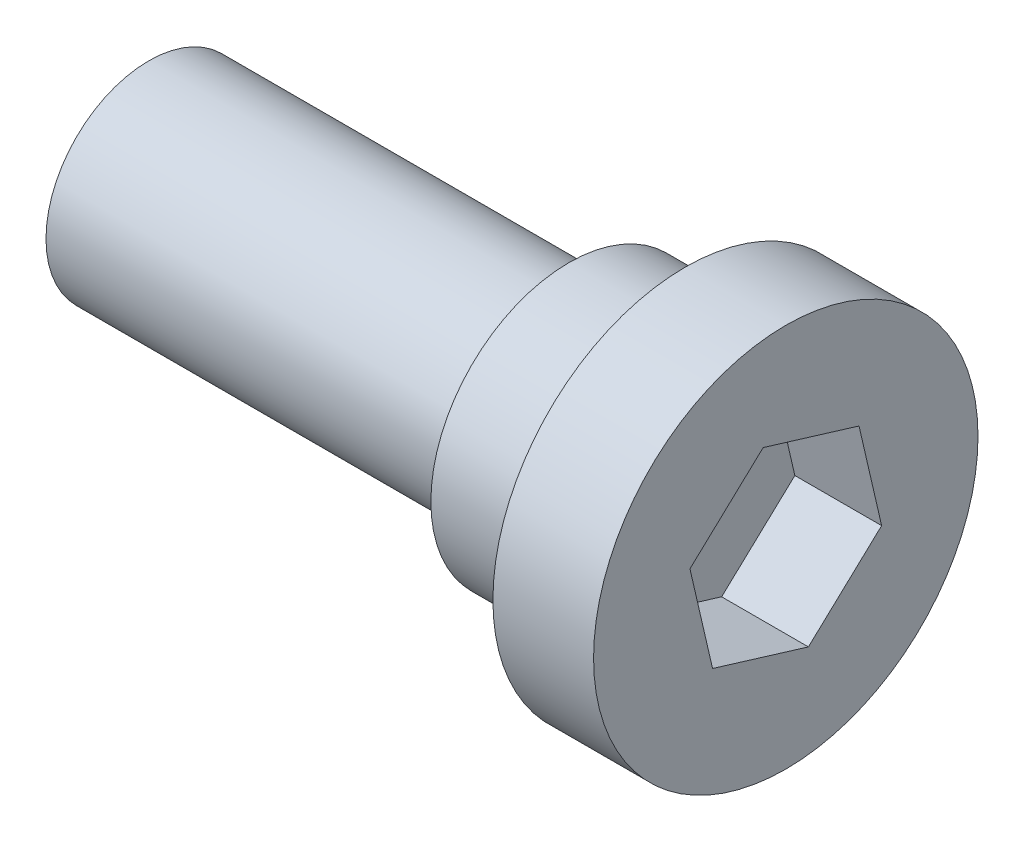
ISO-10303-21;
HEADER;
FILE_DESCRIPTION(('STEP AP214'),'2;1');
FILE_NAME('part.step','',(''),(''),'','','');
FILE_SCHEMA(('AUTOMOTIVE_DESIGN { 1 0 10303 214 1 1 1 1 }'));
ENDSEC;
DATA;
#1=APPLICATION_CONTEXT('core data for automotive mechanical design processes');
#2=APPLICATION_PROTOCOL_DEFINITION('international standard','automotive_design',2000,#1);
#3=PRODUCT_CONTEXT('',#1,'mechanical');
#4=PRODUCT('Part','Part','',(#3));
#5=PRODUCT_RELATED_PRODUCT_CATEGORY('part','',(#4));
#6=PRODUCT_DEFINITION_FORMATION('','',#4);
#7=PRODUCT_DEFINITION_CONTEXT('part definition',#1,'design');
#8=PRODUCT_DEFINITION('design','',#6,#7);
#9=PRODUCT_DEFINITION_SHAPE('','',#8);
#10=(LENGTH_UNIT() NAMED_UNIT(*) SI_UNIT(.MILLI.,.METRE.));
#11=(NAMED_UNIT(*) PLANE_ANGLE_UNIT() SI_UNIT($,.RADIAN.));
#12=(NAMED_UNIT(*) SI_UNIT($,.STERADIAN.) SOLID_ANGLE_UNIT());
#13=UNCERTAINTY_MEASURE_WITH_UNIT(LENGTH_MEASURE(1.E-05),#10,'distance_accuracy_value','');
#14=(GEOMETRIC_REPRESENTATION_CONTEXT(3) GLOBAL_UNCERTAINTY_ASSIGNED_CONTEXT((#13)) GLOBAL_UNIT_ASSIGNED_CONTEXT((#10,
#11,#12)) REPRESENTATION_CONTEXT('',''));
#15=CARTESIAN_POINT('',(0.,0.,0.));
#16=DIRECTION('',(0.,0.,1.));
#17=DIRECTION('',(1.,0.,0.));
#18=AXIS2_PLACEMENT_3D('',#15,#16,#17);
#19=CARTESIAN_POINT('',(40.2556759474531,64.7670130886636,58.028955153829));
#20=DIRECTION('',(1.,0.,0.));
#21=DIRECTION('',(0.,1.,0.));
#22=AXIS2_PLACEMENT_3D('',#19,#20,#21);
#23=PLANE('',#22);
#24=DIRECTION('',(0.,-0.68253617015866,0.730851815640592));
#25=VECTOR('',#24,1.);
#26=CARTESIAN_POINT('',(40.2556759474531,65.891927345877,58.2895338314899));
#27=LINE('',#26,#25);
#28=CARTESIAN_POINT('',(40.2556759474531,65.891927345877,58.2895338314899));
#29=VERTEX_POINT('',#28);
#30=CARTESIAN_POINT('',(40.2556759474531,65.1038024627315,59.1334488164855));
#31=VERTEX_POINT('',#30);
#32=EDGE_CURVE('E68',#29,#31,#27,.T.);
#33=ORIENTED_EDGE('',*,*,#32,.T.);
#34=DIRECTION('',(0.,-0.974204323826063,-0.225667754538841));
#35=VECTOR('',#34,1.);
#36=CARTESIAN_POINT('',(40.2556759474531,65.1038024627315,59.1334488164855));
#37=LINE('',#36,#35);
#38=CARTESIAN_POINT('',(40.2556759474531,63.9788882055181,58.8728701388247));
#39=VERTEX_POINT('',#38);
#40=EDGE_CURVE('E91',#31,#39,#37,.T.);
#41=ORIENTED_EDGE('',*,*,#40,.T.);
#42=DIRECTION('',(0.,-0.291668153667404,-0.956519570179433));
#43=VECTOR('',#42,1.);
#44=CARTESIAN_POINT('',(40.2556759474531,63.9788882055181,58.8728701388247));
#45=LINE('',#44,#43);
#46=CARTESIAN_POINT('',(40.2556759474531,63.6420988314503,57.7683764761682));
#47=VERTEX_POINT('',#46);
#48=EDGE_CURVE('E133',#39,#47,#45,.T.);
#49=ORIENTED_EDGE('',*,*,#48,.T.);
#50=DIRECTION('',(0.,0.68253617015866,-0.730851815640592));
#51=VECTOR('',#50,1.);
#52=CARTESIAN_POINT('',(40.2556759474531,63.6420988314503,57.7683764761682));
#53=LINE('',#52,#51);
#54=CARTESIAN_POINT('',(40.2556759474531,64.4302237145958,56.9244614911725));
#55=VERTEX_POINT('',#54);
#56=EDGE_CURVE('E128',#47,#55,#53,.T.);
#57=ORIENTED_EDGE('',*,*,#56,.T.);
#58=DIRECTION('',(0.,0.974204323826063,0.225667754538842));
#59=VECTOR('',#58,1.);
#60=CARTESIAN_POINT('',(40.2556759474531,64.4302237145958,56.9244614911725));
#61=LINE('',#60,#59);
#62=CARTESIAN_POINT('',(40.2556759474531,65.5551379718092,57.1850401688334));
#63=VERTEX_POINT('',#62);
#64=EDGE_CURVE('E74',#55,#63,#61,.T.);
#65=ORIENTED_EDGE('',*,*,#64,.T.);
#66=DIRECTION('',(0.,0.291668153667404,0.956519570179433));
#67=VECTOR('',#66,1.);
#68=CARTESIAN_POINT('',(40.2556759474531,65.5551379718092,57.1850401688334));
#69=LINE('',#68,#67);
#70=EDGE_CURVE('E71',#63,#29,#69,.T.);
#71=ORIENTED_EDGE('',*,*,#70,.T.);
#72=EDGE_LOOP('',(#33,#41,#49,#57,#65,#71));
#73=FACE_BOUND('',#72,.T.);
#74=ADVANCED_FACE('F17',(#73),#23,.T.);
#75=CARTESIAN_POINT('',(40.2556759474531,65.5551379718092,57.1850401688334));
#76=DIRECTION('',(0.,0.956519570179433,-0.291668153667404));
#77=DIRECTION('',(0.,0.291668153667404,0.956519570179433));
#78=AXIS2_PLACEMENT_3D('',#75,#76,#77);
#79=PLANE('',#78);
#80=ORIENTED_EDGE('',*,*,#70,.F.);
#81=DIRECTION('',(1.,0.,0.));
#82=VECTOR('',#81,1.);
#83=CARTESIAN_POINT('',(40.2556759474531,65.5551379718092,57.1850401688334));
#84=LINE('',#83,#82);
#85=CARTESIAN_POINT('',(41.2556759474531,65.5551379718092,57.1850401688334));
#86=VERTEX_POINT('',#85);
#87=EDGE_CURVE('E123',#63,#86,#84,.T.);
#88=ORIENTED_EDGE('',*,*,#87,.T.);
#89=DIRECTION('',(0.,0.291668153667407,0.956519570179432));
#90=VECTOR('',#89,1.);
#91=CARTESIAN_POINT('',(41.2556759474531,65.5551379718092,57.1850401688334));
#92=LINE('',#91,#90);
#93=CARTESIAN_POINT('',(41.2556759474531,65.891927345877,58.2895338314899));
#94=VERTEX_POINT('',#93);
#95=EDGE_CURVE('E82',#86,#94,#92,.T.);
#96=ORIENTED_EDGE('',*,*,#95,.T.);
#97=DIRECTION('',(1.,0.,0.));
#98=VECTOR('',#97,1.);
#99=CARTESIAN_POINT('',(40.2556759474531,65.891927345877,58.2895338314899));
#100=LINE('',#99,#98);
#101=EDGE_CURVE('E77',#94,#29,#100,.F.);
#102=ORIENTED_EDGE('',*,*,#101,.T.);
#103=EDGE_LOOP('',(#80,#88,#96,#102));
#104=FACE_BOUND('',#103,.T.);
#105=ADVANCED_FACE('F80',(#104),#79,.F.);
#106=CARTESIAN_POINT('',(40.2556759474531,65.891927345877,58.2895338314899));
#107=DIRECTION('',(0.,0.730851815640592,0.68253617015866));
#108=DIRECTION('',(0.,-0.68253617015866,0.730851815640592));
#109=AXIS2_PLACEMENT_3D('',#106,#107,#108);
#110=PLANE('',#109);
#111=ORIENTED_EDGE('',*,*,#32,.F.);
#112=ORIENTED_EDGE('',*,*,#101,.F.);
#113=DIRECTION('',(0.,-0.682536170158655,0.730851815640596));
#114=VECTOR('',#113,1.);
#115=CARTESIAN_POINT('',(41.2556759474531,65.891927345877,58.2895338314899));
#116=LINE('',#115,#114);
#117=CARTESIAN_POINT('',(41.2556759474531,65.1038024627315,59.1334488164855));
#118=VERTEX_POINT('',#117);
#119=EDGE_CURVE('E120',#94,#118,#116,.T.);
#120=ORIENTED_EDGE('',*,*,#119,.T.);
#121=DIRECTION('',(1.,0.,0.));
#122=VECTOR('',#121,1.);
#123=CARTESIAN_POINT('',(40.2556759474531,65.1038024627315,59.1334488164855));
#124=LINE('',#123,#122);
#125=EDGE_CURVE('E88',#118,#31,#124,.F.);
#126=ORIENTED_EDGE('',*,*,#125,.T.);
#127=EDGE_LOOP('',(#111,#112,#120,#126));
#128=FACE_BOUND('',#127,.T.);
#129=ADVANCED_FACE('F86',(#128),#110,.F.);
#130=CARTESIAN_POINT('',(40.2556759474531,65.1038024627315,59.1334488164855));
#131=DIRECTION('',(0.,-0.225667754538841,0.974204323826063));
#132=DIRECTION('',(0.,-0.974204323826063,-0.225667754538841));
#133=AXIS2_PLACEMENT_3D('',#130,#131,#132);
#134=PLANE('',#133);
#135=ORIENTED_EDGE('',*,*,#40,.F.);
#136=ORIENTED_EDGE('',*,*,#125,.F.);
#137=DIRECTION('',(0.,-0.974204323826062,-0.225667754538845));
#138=VECTOR('',#137,1.);
#139=CARTESIAN_POINT('',(41.2556759474531,65.1038024627315,59.1334488164855));
#140=LINE('',#139,#138);
#141=CARTESIAN_POINT('',(41.2556759474531,63.9788882055181,58.8728701388247));
#142=VERTEX_POINT('',#141);
#143=EDGE_CURVE('E118',#118,#142,#140,.T.);
#144=ORIENTED_EDGE('',*,*,#143,.T.);
#145=DIRECTION('',(1.,0.,0.));
#146=VECTOR('',#145,1.);
#147=CARTESIAN_POINT('',(40.2556759474531,63.9788882055181,58.8728701388247));
#148=LINE('',#147,#146);
#149=EDGE_CURVE('E135',#142,#39,#148,.F.);
#150=ORIENTED_EDGE('',*,*,#149,.T.);
#151=EDGE_LOOP('',(#135,#136,#144,#150));
#152=FACE_BOUND('',#151,.T.);
#153=ADVANCED_FACE('F140',(#152),#134,.F.);
#154=CARTESIAN_POINT('',(40.2556759474531,63.9788882055181,58.8728701388247));
#155=DIRECTION('',(0.,-0.956519570179433,0.291668153667404));
#156=DIRECTION('',(0.,-0.291668153667404,-0.956519570179433));
#157=AXIS2_PLACEMENT_3D('',#154,#155,#156);
#158=PLANE('',#157);
#159=ORIENTED_EDGE('',*,*,#48,.F.);
#160=ORIENTED_EDGE('',*,*,#149,.F.);
#161=DIRECTION('',(0.,-0.291668153667406,-0.956519570179433));
#162=VECTOR('',#161,1.);
#163=CARTESIAN_POINT('',(41.2556759474531,63.9788882055181,58.8728701388247));
#164=LINE('',#163,#162);
#165=CARTESIAN_POINT('',(41.2556759474531,63.6420988314503,57.7683764761682));
#166=VERTEX_POINT('',#165);
#167=EDGE_CURVE('E114',#142,#166,#164,.T.);
#168=ORIENTED_EDGE('',*,*,#167,.T.);
#169=DIRECTION('',(1.,0.,0.));
#170=VECTOR('',#169,1.);
#171=CARTESIAN_POINT('',(40.2556759474531,63.6420988314503,57.7683764761682));
#172=LINE('',#171,#170);
#173=EDGE_CURVE('E130',#166,#47,#172,.F.);
#174=ORIENTED_EDGE('',*,*,#173,.T.);
#175=EDGE_LOOP('',(#159,#160,#168,#174));
#176=FACE_BOUND('',#175,.T.);
#177=ADVANCED_FACE('F144',(#176),#158,.F.);
#178=CARTESIAN_POINT('',(40.2556759474531,63.6420988314503,57.7683764761682));
#179=DIRECTION('',(0.,-0.730851815640592,-0.68253617015866));
#180=DIRECTION('',(0.,0.68253617015866,-0.730851815640592));
#181=AXIS2_PLACEMENT_3D('',#178,#179,#180);
#182=PLANE('',#181);
#183=ORIENTED_EDGE('',*,*,#56,.F.);
#184=ORIENTED_EDGE('',*,*,#173,.F.);
#185=DIRECTION('',(0.,0.682536170158658,-0.730851815640593));
#186=VECTOR('',#185,1.);
#187=CARTESIAN_POINT('',(41.2556759474531,63.6420988314503,57.7683764761682));
#188=LINE('',#187,#186);
#189=CARTESIAN_POINT('',(41.2556759474531,64.4302237145958,56.9244614911725));
#190=VERTEX_POINT('',#189);
#191=EDGE_CURVE('E35',#166,#190,#188,.T.);
#192=ORIENTED_EDGE('',*,*,#191,.T.);
#193=DIRECTION('',(1.,0.,0.));
#194=VECTOR('',#193,1.);
#195=CARTESIAN_POINT('',(40.2556759474531,64.4302237145958,56.9244614911725));
#196=LINE('',#195,#194);
#197=EDGE_CURVE('E126',#190,#55,#196,.F.);
#198=ORIENTED_EDGE('',*,*,#197,.T.);
#199=EDGE_LOOP('',(#183,#184,#192,#198));
#200=FACE_BOUND('',#199,.T.);
#201=ADVANCED_FACE('F146',(#200),#182,.F.);
#202=CARTESIAN_POINT('',(40.2556759474531,64.4302237145958,56.9244614911725));
#203=DIRECTION('',(0.,0.225667754538842,-0.974204323826063));
#204=DIRECTION('',(0.,0.974204323826063,0.225667754538842));
#205=AXIS2_PLACEMENT_3D('',#202,#203,#204);
#206=PLANE('',#205);
#207=ORIENTED_EDGE('',*,*,#64,.F.);
#208=ORIENTED_EDGE('',*,*,#197,.F.);
#209=DIRECTION('',(0.,0.974204323826062,0.225667754538845));
#210=VECTOR('',#209,1.);
#211=CARTESIAN_POINT('',(41.2556759474531,64.4302237145958,56.9244614911725));
#212=LINE('',#211,#210);
#213=EDGE_CURVE('E107',#190,#86,#212,.T.);
#214=ORIENTED_EDGE('',*,*,#213,.T.);
#215=ORIENTED_EDGE('',*,*,#87,.F.);
#216=EDGE_LOOP('',(#207,#208,#214,#215));
#217=FACE_BOUND('',#216,.T.);
#218=ADVANCED_FACE('F147',(#217),#206,.F.);
#219=CARTESIAN_POINT('',(41.2556759474531,64.7670130886636,58.028955153829));
#220=DIRECTION('',(-1.,0.,0.));
#221=DIRECTION('',(0.,-1.,0.));
#222=AXIS2_PLACEMENT_3D('',#219,#220,#221);
#223=PLANE('',#222);
#224=ORIENTED_EDGE('',*,*,#191,.F.);
#225=ORIENTED_EDGE('',*,*,#167,.F.);
#226=ORIENTED_EDGE('',*,*,#143,.F.);
#227=ORIENTED_EDGE('',*,*,#119,.F.);
#228=ORIENTED_EDGE('',*,*,#95,.F.);
#229=ORIENTED_EDGE('',*,*,#213,.F.);
#230=EDGE_LOOP('',(#224,#225,#226,#227,#228,#229));
#231=FACE_BOUND('',#230,.T.);
#232=CARTESIAN_POINT('',(41.2556759474531,64.7670130886636,58.028955153829));
#233=DIRECTION('',(-1.,0.,0.));
#234=DIRECTION('',(0.,-1.,0.));
#235=AXIS2_PLACEMENT_3D('',#232,#233,#234);
#236=CIRCLE('',#235,2.21499999999999);
#237=CARTESIAN_POINT('',(41.2556759474531,62.5520130886636,58.028955153829));
#238=VERTEX_POINT('',#237);
#239=EDGE_CURVE('E20',#238,#238,#236,.T.);
#240=ORIENTED_EDGE('',*,*,#239,.F.);
#241=EDGE_LOOP('',(#240));
#242=FACE_BOUND('',#241,.T.);
#243=ADVANCED_FACE('F149',(#231,#242),#223,.F.);
#244=CARTESIAN_POINT('',(33.9156759474531,64.7670130886636,58.028955153829));
#245=DIRECTION('',(-1.,0.,0.));
#246=DIRECTION('',(0.,-1.,0.));
#247=AXIS2_PLACEMENT_3D('',#244,#245,#246);
#248=CYLINDRICAL_SURFACE('',#247,2.21499999999999);
#249=ORIENTED_EDGE('',*,*,#239,.T.);
#250=EDGE_LOOP('',(#249));
#251=FACE_BOUND('',#250,.T.);
#252=CARTESIAN_POINT('',(40.0956759474531,64.7670130886636,58.028955153829));
#253=DIRECTION('',(-1.,0.,0.));
#254=DIRECTION('',(0.,-1.,0.));
#255=AXIS2_PLACEMENT_3D('',#252,#253,#254);
#256=CIRCLE('',#255,2.21499999999999);
#257=CARTESIAN_POINT('',(40.0956759474531,62.5520130886636,58.028955153829));
#258=VERTEX_POINT('',#257);
#259=EDGE_CURVE('E102',#258,#258,#256,.F.);
#260=ORIENTED_EDGE('',*,*,#259,.T.);
#261=EDGE_LOOP('',(#260));
#262=FACE_BOUND('',#261,.T.);
#263=ADVANCED_FACE('F156',(#251,#262),#248,.T.);
#264=CARTESIAN_POINT('',(40.0956759474531,66.9248756659384,58.5288092301326));
#265=DIRECTION('',(1.,0.,0.));
#266=DIRECTION('',(0.,1.,0.));
#267=AXIS2_PLACEMENT_3D('',#264,#265,#266);
#268=PLANE('',#267);
#269=CARTESIAN_POINT('',(40.0956759474531,64.7670130886636,58.028955153829));
#270=DIRECTION('',(-1.,0.,0.));
#271=DIRECTION('',(0.,-1.,0.));
#272=AXIS2_PLACEMENT_3D('',#269,#270,#271);
#273=CIRCLE('',#272,1.59000000000001);
#274=CARTESIAN_POINT('',(40.0956759474531,63.1770130886636,58.028955153829));
#275=VERTEX_POINT('',#274);
#276=EDGE_CURVE('E100',#275,#275,#273,.T.);
#277=ORIENTED_EDGE('',*,*,#276,.F.);
#278=EDGE_LOOP('',(#277));
#279=FACE_BOUND('',#278,.T.);
#280=ORIENTED_EDGE('',*,*,#259,.F.);
#281=EDGE_LOOP('',(#280));
#282=FACE_BOUND('',#281,.T.);
#283=ADVANCED_FACE('F179',(#279,#282),#268,.F.);
#284=CARTESIAN_POINT('',(33.9156759474531,64.7670130886636,58.028955153829));
#285=DIRECTION('',(-1.,0.,0.));
#286=DIRECTION('',(0.,-1.,0.));
#287=AXIS2_PLACEMENT_3D('',#284,#285,#286);
#288=CYLINDRICAL_SURFACE('',#287,1.59000000000001);
#289=ORIENTED_EDGE('',*,*,#276,.T.);
#290=EDGE_LOOP('',(#289));
#291=FACE_BOUND('',#290,.T.);
#292=CARTESIAN_POINT('',(38.7556759474531,64.7670130886636,58.028955153829));
#293=DIRECTION('',(-1.,0.,0.));
#294=DIRECTION('',(0.,-1.,0.));
#295=AXIS2_PLACEMENT_3D('',#292,#293,#294);
#296=CIRCLE('',#295,1.59000000000001);
#297=CARTESIAN_POINT('',(38.7556759474531,63.1770130886636,58.028955153829));
#298=VERTEX_POINT('',#297);
#299=EDGE_CURVE('E97',#298,#298,#296,.F.);
#300=ORIENTED_EDGE('',*,*,#299,.T.);
#301=EDGE_LOOP('',(#300));
#302=FACE_BOUND('',#301,.T.);
#303=ADVANCED_FACE('F175',(#291,#302),#288,.T.);
#304=CARTESIAN_POINT('',(38.7556759474531,66.3159979635471,58.3877668835458));
#305=DIRECTION('',(1.,0.,0.));
#306=DIRECTION('',(0.,1.,0.));
#307=AXIS2_PLACEMENT_3D('',#304,#305,#306);
#308=PLANE('',#307);
#309=CARTESIAN_POINT('',(38.7556759474531,64.7670130886636,58.028955153829));
#310=DIRECTION('',(-1.,0.,0.));
#311=DIRECTION('',(0.,-1.,0.));
#312=AXIS2_PLACEMENT_3D('',#309,#310,#311);
#313=CIRCLE('',#312,1.185);
#314=CARTESIAN_POINT('',(38.7556759474531,63.5820130886637,58.028955153829));
#315=VERTEX_POINT('',#314);
#316=EDGE_CURVE('E26',#315,#315,#313,.T.);
#317=ORIENTED_EDGE('',*,*,#316,.F.);
#318=EDGE_LOOP('',(#317));
#319=FACE_BOUND('',#318,.T.);
#320=ORIENTED_EDGE('',*,*,#299,.F.);
#321=EDGE_LOOP('',(#320));
#322=FACE_BOUND('',#321,.T.);
#323=ADVANCED_FACE('F168',(#319,#322),#308,.F.);
#324=CARTESIAN_POINT('',(33.9156759474531,65.9214452123975,58.2963714429576));
#325=DIRECTION('',(1.,0.,0.));
#326=DIRECTION('',(0.,1.,0.));
#327=AXIS2_PLACEMENT_3D('',#324,#325,#326);
#328=PLANE('',#327);
#329=CARTESIAN_POINT('',(33.9156759474531,64.7670130886636,58.028955153829));
#330=DIRECTION('',(-1.,0.,0.));
#331=DIRECTION('',(0.,-1.,0.));
#332=AXIS2_PLACEMENT_3D('',#329,#330,#331);
#333=CIRCLE('',#332,1.185);
#334=CARTESIAN_POINT('',(33.9156759474531,63.5820130886637,58.028955153829));
#335=VERTEX_POINT('',#334);
#336=EDGE_CURVE('E11',#335,#335,#333,.F.);
#337=ORIENTED_EDGE('',*,*,#336,.F.);
#338=EDGE_LOOP('',(#337));
#339=FACE_BOUND('',#338,.T.);
#340=ADVANCED_FACE('F162',(#339),#328,.F.);
#341=CARTESIAN_POINT('',(33.9156759474531,64.7670130886636,58.028955153829));
#342=DIRECTION('',(-1.,0.,0.));
#343=DIRECTION('',(0.,-1.,0.));
#344=AXIS2_PLACEMENT_3D('',#341,#342,#343);
#345=CYLINDRICAL_SURFACE('',#344,1.185);
#346=ORIENTED_EDGE('',*,*,#316,.T.);
#347=EDGE_LOOP('',(#346));
#348=FACE_BOUND('',#347,.T.);
#349=ORIENTED_EDGE('',*,*,#336,.T.);
#350=EDGE_LOOP('',(#349));
#351=FACE_BOUND('',#350,.T.);
#352=ADVANCED_FACE('F160',(#348,#351),#345,.T.);
#353=CLOSED_SHELL('',(#74,#105,#129,#153,#177,#201,#218,#243,#263,#283,#303,#323,#340,#352));
#354=MANIFOLD_SOLID_BREP('B1',#353);
#355=ADVANCED_BREP_SHAPE_REPRESENTATION('',(#18,#354),#14);
#356=SHAPE_DEFINITION_REPRESENTATION(#9,#355);
ENDSEC;
END-ISO-10303-21;
